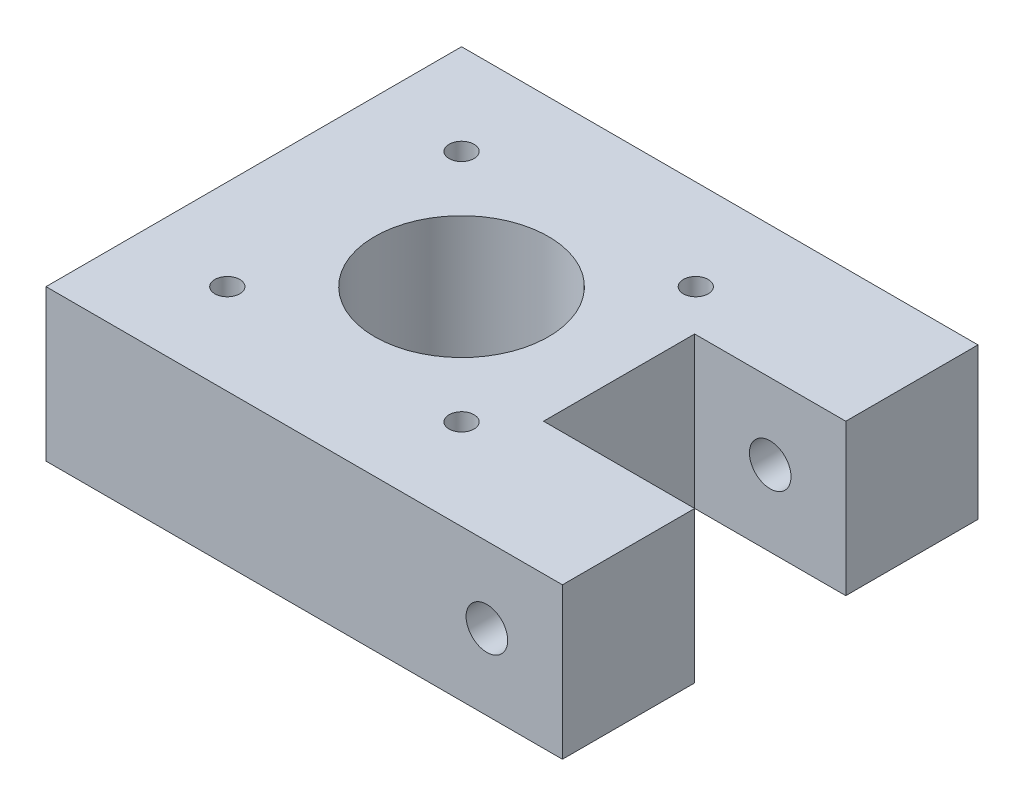
ISO-10303-21;
HEADER;
FILE_DESCRIPTION(('STEP AP214'),'2;1');
FILE_NAME('part.step','',(''),(''),'','','');
FILE_SCHEMA(('AUTOMOTIVE_DESIGN { 1 0 10303 214 1 1 1 1 }'));
ENDSEC;
DATA;
#1=APPLICATION_CONTEXT('core data for automotive mechanical design processes');
#2=APPLICATION_PROTOCOL_DEFINITION('international standard','automotive_design',2000,#1);
#3=PRODUCT_CONTEXT('',#1,'mechanical');
#4=PRODUCT('Part','Part','',(#3));
#5=PRODUCT_RELATED_PRODUCT_CATEGORY('part','',(#4));
#6=PRODUCT_DEFINITION_FORMATION('','',#4);
#7=PRODUCT_DEFINITION_CONTEXT('part definition',#1,'design');
#8=PRODUCT_DEFINITION('design','',#6,#7);
#9=PRODUCT_DEFINITION_SHAPE('','',#8);
#10=(LENGTH_UNIT() NAMED_UNIT(*) SI_UNIT(.MILLI.,.METRE.));
#11=(NAMED_UNIT(*) PLANE_ANGLE_UNIT() SI_UNIT($,.RADIAN.));
#12=(NAMED_UNIT(*) SI_UNIT($,.STERADIAN.) SOLID_ANGLE_UNIT());
#13=UNCERTAINTY_MEASURE_WITH_UNIT(LENGTH_MEASURE(1.E-05),#10,'distance_accuracy_value','');
#14=(GEOMETRIC_REPRESENTATION_CONTEXT(3) GLOBAL_UNCERTAINTY_ASSIGNED_CONTEXT((#13)) GLOBAL_UNIT_ASSIGNED_CONTEXT((#10,
#11,#12)) REPRESENTATION_CONTEXT('',''));
#15=CARTESIAN_POINT('',(0.,0.,0.));
#16=DIRECTION('',(0.,0.,1.));
#17=DIRECTION('',(1.,0.,0.));
#18=AXIS2_PLACEMENT_3D('',#15,#16,#17);
#19=CARTESIAN_POINT('',(-15.5,20.,-15.5));
#20=DIRECTION('',(0.,-1.,0.));
#21=DIRECTION('',(0.,0.,-1.));
#22=AXIS2_PLACEMENT_3D('',#19,#20,#21);
#23=CYLINDRICAL_SURFACE('',#22,1.65);
#24=CARTESIAN_POINT('',(-15.5,20.,-15.5));
#25=DIRECTION('',(0.,1.,0.));
#26=DIRECTION('',(0.,0.,1.));
#27=AXIS2_PLACEMENT_3D('',#24,#25,#26);
#28=CIRCLE('',#27,1.65);
#29=CARTESIAN_POINT('',(-15.5,20.,-13.85));
#30=VERTEX_POINT('',#29);
#31=EDGE_CURVE('E193',#30,#30,#28,.T.);
#32=ORIENTED_EDGE('',*,*,#31,.T.);
#33=EDGE_LOOP('',(#32));
#34=FACE_BOUND('',#33,.T.);
#35=CARTESIAN_POINT('',(-15.5,16.,-15.5));
#36=DIRECTION('',(0.,-1.,0.));
#37=DIRECTION('',(0.,0.,-1.));
#38=AXIS2_PLACEMENT_3D('',#35,#36,#37);
#39=CIRCLE('',#38,1.65);
#40=CARTESIAN_POINT('',(-15.5,16.,-17.15));
#41=VERTEX_POINT('',#40);
#42=EDGE_CURVE('E237',#41,#41,#39,.T.);
#43=ORIENTED_EDGE('',*,*,#42,.T.);
#44=EDGE_LOOP('',(#43));
#45=FACE_BOUND('',#44,.T.);
#46=ADVANCED_FACE('F51',(#34,#45),#23,.F.);
#47=CARTESIAN_POINT('',(15.5,20.,-15.5));
#48=DIRECTION('',(0.,-1.,0.));
#49=DIRECTION('',(0.,0.,-1.));
#50=AXIS2_PLACEMENT_3D('',#47,#48,#49);
#51=CYLINDRICAL_SURFACE('',#50,1.65);
#52=CARTESIAN_POINT('',(15.5,20.,-15.5));
#53=DIRECTION('',(0.,1.,0.));
#54=DIRECTION('',(0.,0.,1.));
#55=AXIS2_PLACEMENT_3D('',#52,#53,#54);
#56=CIRCLE('',#55,1.65);
#57=CARTESIAN_POINT('',(15.5,20.,-13.85));
#58=VERTEX_POINT('',#57);
#59=EDGE_CURVE('E184',#58,#58,#56,.T.);
#60=ORIENTED_EDGE('',*,*,#59,.T.);
#61=EDGE_LOOP('',(#60));
#62=FACE_BOUND('',#61,.T.);
#63=CARTESIAN_POINT('',(15.5,16.,-15.5));
#64=DIRECTION('',(0.,-1.,0.));
#65=DIRECTION('',(0.,0.,-1.));
#66=AXIS2_PLACEMENT_3D('',#63,#64,#65);
#67=CIRCLE('',#66,1.65);
#68=CARTESIAN_POINT('',(15.5,16.,-17.15));
#69=VERTEX_POINT('',#68);
#70=EDGE_CURVE('E234',#69,#69,#67,.T.);
#71=ORIENTED_EDGE('',*,*,#70,.T.);
#72=EDGE_LOOP('',(#71));
#73=FACE_BOUND('',#72,.T.);
#74=ADVANCED_FACE('F312',(#62,#73),#51,.F.);
#75=CARTESIAN_POINT('',(15.5000000000003,20.,15.5));
#76=DIRECTION('',(0.,-1.,0.));
#77=DIRECTION('',(0.,0.,-1.));
#78=AXIS2_PLACEMENT_3D('',#75,#76,#77);
#79=CYLINDRICAL_SURFACE('',#78,1.65);
#80=CARTESIAN_POINT('',(15.5000000000003,20.,15.5));
#81=DIRECTION('',(0.,1.,0.));
#82=DIRECTION('',(0.,0.,1.));
#83=AXIS2_PLACEMENT_3D('',#80,#81,#82);
#84=CIRCLE('',#83,1.65);
#85=CARTESIAN_POINT('',(15.5000000000003,20.,17.15));
#86=VERTEX_POINT('',#85);
#87=EDGE_CURVE('E180',#86,#86,#84,.T.);
#88=ORIENTED_EDGE('',*,*,#87,.T.);
#89=EDGE_LOOP('',(#88));
#90=FACE_BOUND('',#89,.T.);
#91=CARTESIAN_POINT('',(15.5000000000003,16.,15.5));
#92=DIRECTION('',(0.,-1.,0.));
#93=DIRECTION('',(0.,0.,-1.));
#94=AXIS2_PLACEMENT_3D('',#91,#92,#93);
#95=CIRCLE('',#94,1.65);
#96=CARTESIAN_POINT('',(15.5000000000003,16.,13.85));
#97=VERTEX_POINT('',#96);
#98=EDGE_CURVE('E229',#97,#97,#95,.T.);
#99=ORIENTED_EDGE('',*,*,#98,.T.);
#100=EDGE_LOOP('',(#99));
#101=FACE_BOUND('',#100,.T.);
#102=ADVANCED_FACE('F318',(#90,#101),#79,.F.);
#103=CARTESIAN_POINT('',(-15.4999999999997,20.,15.5));
#104=DIRECTION('',(0.,-1.,0.));
#105=DIRECTION('',(0.,0.,-1.));
#106=AXIS2_PLACEMENT_3D('',#103,#104,#105);
#107=CYLINDRICAL_SURFACE('',#106,1.65);
#108=CARTESIAN_POINT('',(-15.4999999999997,20.,15.5));
#109=DIRECTION('',(0.,1.,0.));
#110=DIRECTION('',(0.,0.,1.));
#111=AXIS2_PLACEMENT_3D('',#108,#109,#110);
#112=CIRCLE('',#111,1.65);
#113=CARTESIAN_POINT('',(-15.4999999999997,20.,17.15));
#114=VERTEX_POINT('',#113);
#115=EDGE_CURVE('E177',#114,#114,#112,.T.);
#116=ORIENTED_EDGE('',*,*,#115,.T.);
#117=EDGE_LOOP('',(#116));
#118=FACE_BOUND('',#117,.T.);
#119=CARTESIAN_POINT('',(-15.4999999999997,16.,15.5));
#120=DIRECTION('',(0.,-1.,0.));
#121=DIRECTION('',(0.,0.,-1.));
#122=AXIS2_PLACEMENT_3D('',#119,#120,#121);
#123=CIRCLE('',#122,1.65);
#124=CARTESIAN_POINT('',(-15.4999999999997,16.,13.85));
#125=VERTEX_POINT('',#124);
#126=EDGE_CURVE('E225',#125,#125,#123,.T.);
#127=ORIENTED_EDGE('',*,*,#126,.T.);
#128=EDGE_LOOP('',(#127));
#129=FACE_BOUND('',#128,.T.);
#130=ADVANCED_FACE('F363',(#118,#129),#107,.F.);
#131=CARTESIAN_POINT('',(20.85,20.,-20.85));
#132=DIRECTION('',(-1.,0.,0.));
#133=DIRECTION('',(0.,0.,1.));
#134=AXIS2_PLACEMENT_3D('',#131,#132,#133);
#135=PLANE('',#134);
#136=DIRECTION('',(0.,1.,0.));
#137=VECTOR('',#136,1.);
#138=CARTESIAN_POINT('',(20.85,0.,10.));
#139=LINE('',#138,#137);
#140=CARTESIAN_POINT('',(20.85,0.,10.));
#141=VERTEX_POINT('',#140);
#142=CARTESIAN_POINT('',(20.85,20.,10.));
#143=VERTEX_POINT('',#142);
#144=EDGE_CURVE('E73',#141,#143,#139,.T.);
#145=ORIENTED_EDGE('',*,*,#144,.F.);
#146=DIRECTION('',(0.,0.,-1.));
#147=VECTOR('',#146,1.);
#148=CARTESIAN_POINT('',(20.85,0.,-20.85));
#149=LINE('',#148,#147);
#150=CARTESIAN_POINT('',(20.85,0.,-9.99999999999999));
#151=VERTEX_POINT('',#150);
#152=EDGE_CURVE('E143',#141,#151,#149,.T.);
#153=ORIENTED_EDGE('',*,*,#152,.T.);
#154=DIRECTION('',(0.,1.,0.));
#155=VECTOR('',#154,1.);
#156=CARTESIAN_POINT('',(20.85,0.,-9.99999999999999));
#157=LINE('',#156,#155);
#158=CARTESIAN_POINT('',(20.85,20.,-9.99999999999999));
#159=VERTEX_POINT('',#158);
#160=EDGE_CURVE('E145',#151,#159,#157,.T.);
#161=ORIENTED_EDGE('',*,*,#160,.T.);
#162=DIRECTION('',(0.,0.,-1.));
#163=VECTOR('',#162,1.);
#164=CARTESIAN_POINT('',(20.85,20.,-20.85));
#165=LINE('',#164,#163);
#166=EDGE_CURVE('E69',#143,#159,#165,.T.);
#167=ORIENTED_EDGE('',*,*,#166,.F.);
#168=EDGE_LOOP('',(#145,#153,#161,#167));
#169=FACE_BOUND('',#168,.T.);
#170=ADVANCED_FACE('F53',(#169),#135,.F.);
#171=CARTESIAN_POINT('',(0.,20.,0.));
#172=DIRECTION('',(0.,1.,0.));
#173=DIRECTION('',(0.,0.,1.));
#174=AXIS2_PLACEMENT_3D('',#171,#172,#173);
#175=PLANE('',#174);
#176=ORIENTED_EDGE('',*,*,#87,.F.);
#177=EDGE_LOOP('',(#176));
#178=FACE_BOUND('',#177,.T.);
#179=CARTESIAN_POINT('',(0.,20.,0.));
#180=DIRECTION('',(0.,1.,0.));
#181=DIRECTION('',(0.,0.,1.));
#182=AXIS2_PLACEMENT_3D('',#179,#180,#181);
#183=CIRCLE('',#182,11.5);
#184=CARTESIAN_POINT('',(0.,20.,11.5));
#185=VERTEX_POINT('',#184);
#186=EDGE_CURVE('E189',#185,#185,#183,.T.);
#187=ORIENTED_EDGE('',*,*,#186,.F.);
#188=EDGE_LOOP('',(#187));
#189=FACE_BOUND('',#188,.T.);
#190=DIRECTION('',(1.,0.,0.));
#191=VECTOR('',#190,1.);
#192=CARTESIAN_POINT('',(-27.5,20.,27.5));
#193=LINE('',#192,#191);
#194=CARTESIAN_POINT('',(-27.5,20.,27.5));
#195=VERTEX_POINT('',#194);
#196=CARTESIAN_POINT('',(40.85,20.,27.5));
#197=VERTEX_POINT('',#196);
#198=EDGE_CURVE('E209',#195,#197,#193,.T.);
#199=ORIENTED_EDGE('',*,*,#198,.T.);
#200=DIRECTION('',(0.,0.,1.));
#201=VECTOR('',#200,1.);
#202=CARTESIAN_POINT('',(40.85,20.,0.));
#203=LINE('',#202,#201);
#204=CARTESIAN_POINT('',(40.85,20.,10.));
#205=VERTEX_POINT('',#204);
#206=EDGE_CURVE('E128',#205,#197,#203,.T.);
#207=ORIENTED_EDGE('',*,*,#206,.F.);
#208=DIRECTION('',(-1.,0.,0.));
#209=VECTOR('',#208,1.);
#210=CARTESIAN_POINT('',(40.85,20.,10.));
#211=LINE('',#210,#209);
#212=EDGE_CURVE('E123',#205,#143,#211,.T.);
#213=ORIENTED_EDGE('',*,*,#212,.T.);
#214=ORIENTED_EDGE('',*,*,#166,.T.);
#215=DIRECTION('',(-1.,0.,0.));
#216=VECTOR('',#215,1.);
#217=CARTESIAN_POINT('',(40.85,20.,-9.99999999999998));
#218=LINE('',#217,#216);
#219=CARTESIAN_POINT('',(40.85,20.,-9.99999999999998));
#220=VERTEX_POINT('',#219);
#221=EDGE_CURVE('E169',#220,#159,#218,.T.);
#222=ORIENTED_EDGE('',*,*,#221,.F.);
#223=DIRECTION('',(0.,0.,1.));
#224=VECTOR('',#223,1.);
#225=CARTESIAN_POINT('',(40.85,20.,0.));
#226=LINE('',#225,#224);
#227=CARTESIAN_POINT('',(40.85,20.,-27.5));
#228=VERTEX_POINT('',#227);
#229=EDGE_CURVE('E167',#228,#220,#226,.T.);
#230=ORIENTED_EDGE('',*,*,#229,.F.);
#231=DIRECTION('',(-1.,0.,0.));
#232=VECTOR('',#231,1.);
#233=CARTESIAN_POINT('',(-27.5,20.,-27.5));
#234=LINE('',#233,#232);
#235=CARTESIAN_POINT('',(-27.5,20.,-27.5));
#236=VERTEX_POINT('',#235);
#237=EDGE_CURVE('E202',#228,#236,#234,.T.);
#238=ORIENTED_EDGE('',*,*,#237,.T.);
#239=DIRECTION('',(0.,0.,1.));
#240=VECTOR('',#239,1.);
#241=CARTESIAN_POINT('',(-27.5,20.,-27.5));
#242=LINE('',#241,#240);
#243=EDGE_CURVE('E206',#236,#195,#242,.T.);
#244=ORIENTED_EDGE('',*,*,#243,.T.);
#245=EDGE_LOOP('',(#199,#207,#213,#214,#222,#230,#238,#244));
#246=FACE_BOUND('',#245,.T.);
#247=ORIENTED_EDGE('',*,*,#31,.F.);
#248=EDGE_LOOP('',(#247));
#249=FACE_BOUND('',#248,.T.);
#250=ORIENTED_EDGE('',*,*,#59,.F.);
#251=EDGE_LOOP('',(#250));
#252=FACE_BOUND('',#251,.T.);
#253=ORIENTED_EDGE('',*,*,#115,.F.);
#254=EDGE_LOOP('',(#253));
#255=FACE_BOUND('',#254,.T.);
#256=ADVANCED_FACE('F324',(#178,#189,#246,#249,#252,#255),#175,.T.);
#257=CARTESIAN_POINT('',(0.,0.,0.));
#258=DIRECTION('',(0.,1.,0.));
#259=DIRECTION('',(0.,0.,1.));
#260=AXIS2_PLACEMENT_3D('',#257,#258,#259);
#261=PLANE('',#260);
#262=CARTESIAN_POINT('',(-15.4999999999994,0.,-15.5));
#263=DIRECTION('',(0.,-1.,0.));
#264=DIRECTION('',(0.,0.,-1.));
#265=AXIS2_PLACEMENT_3D('',#262,#263,#264);
#266=CIRCLE('',#265,3.);
#267=CARTESIAN_POINT('',(-15.4999999999994,0.,-18.5));
#268=VERTEX_POINT('',#267);
#269=EDGE_CURVE('E260',#268,#268,#266,.T.);
#270=ORIENTED_EDGE('',*,*,#269,.F.);
#271=EDGE_LOOP('',(#270));
#272=FACE_BOUND('',#271,.T.);
#273=CARTESIAN_POINT('',(15.5000000000006,0.,-15.5));
#274=DIRECTION('',(0.,-1.,0.));
#275=DIRECTION('',(0.,0.,-1.));
#276=AXIS2_PLACEMENT_3D('',#273,#274,#275);
#277=CIRCLE('',#276,3.);
#278=CARTESIAN_POINT('',(15.5000000000006,0.,-18.5));
#279=VERTEX_POINT('',#278);
#280=EDGE_CURVE('E269',#279,#279,#277,.T.);
#281=ORIENTED_EDGE('',*,*,#280,.F.);
#282=EDGE_LOOP('',(#281));
#283=FACE_BOUND('',#282,.T.);
#284=CARTESIAN_POINT('',(15.5000000000003,0.,15.5));
#285=DIRECTION('',(0.,-1.,0.));
#286=DIRECTION('',(0.,0.,-1.));
#287=AXIS2_PLACEMENT_3D('',#284,#285,#286);
#288=CIRCLE('',#287,3.);
#289=CARTESIAN_POINT('',(15.5000000000003,0.,12.5));
#290=VERTEX_POINT('',#289);
#291=EDGE_CURVE('E252',#290,#290,#288,.T.);
#292=ORIENTED_EDGE('',*,*,#291,.F.);
#293=EDGE_LOOP('',(#292));
#294=FACE_BOUND('',#293,.T.);
#295=CARTESIAN_POINT('',(-15.4999999999997,0.,15.5));
#296=DIRECTION('',(0.,-1.,0.));
#297=DIRECTION('',(0.,0.,-1.));
#298=AXIS2_PLACEMENT_3D('',#295,#296,#297);
#299=CIRCLE('',#298,3.);
#300=CARTESIAN_POINT('',(-15.4999999999997,0.,12.5));
#301=VERTEX_POINT('',#300);
#302=EDGE_CURVE('E249',#301,#301,#299,.T.);
#303=ORIENTED_EDGE('',*,*,#302,.F.);
#304=EDGE_LOOP('',(#303));
#305=FACE_BOUND('',#304,.T.);
#306=ORIENTED_EDGE('',*,*,#152,.F.);
#307=DIRECTION('',(-1.,0.,0.));
#308=VECTOR('',#307,1.);
#309=CARTESIAN_POINT('',(40.85,0.,10.));
#310=LINE('',#309,#308);
#311=CARTESIAN_POINT('',(40.85,0.,10.));
#312=VERTEX_POINT('',#311);
#313=EDGE_CURVE('E121',#312,#141,#310,.T.);
#314=ORIENTED_EDGE('',*,*,#313,.F.);
#315=DIRECTION('',(0.,0.,-1.));
#316=VECTOR('',#315,1.);
#317=CARTESIAN_POINT('',(40.85,0.,0.));
#318=LINE('',#317,#316);
#319=CARTESIAN_POINT('',(40.85,0.,27.5));
#320=VERTEX_POINT('',#319);
#321=EDGE_CURVE('E129',#320,#312,#318,.T.);
#322=ORIENTED_EDGE('',*,*,#321,.F.);
#323=DIRECTION('',(1.,0.,0.));
#324=VECTOR('',#323,1.);
#325=CARTESIAN_POINT('',(-27.5,0.,27.5));
#326=LINE('',#325,#324);
#327=CARTESIAN_POINT('',(-27.5,0.,27.5));
#328=VERTEX_POINT('',#327);
#329=EDGE_CURVE('E203',#328,#320,#326,.T.);
#330=ORIENTED_EDGE('',*,*,#329,.F.);
#331=DIRECTION('',(0.,0.,1.));
#332=VECTOR('',#331,1.);
#333=CARTESIAN_POINT('',(-27.5,0.,-27.5));
#334=LINE('',#333,#332);
#335=CARTESIAN_POINT('',(-27.5,0.,-27.5));
#336=VERTEX_POINT('',#335);
#337=EDGE_CURVE('E217',#336,#328,#334,.T.);
#338=ORIENTED_EDGE('',*,*,#337,.F.);
#339=DIRECTION('',(-1.,0.,0.));
#340=VECTOR('',#339,1.);
#341=CARTESIAN_POINT('',(-27.5,0.,-27.5));
#342=LINE('',#341,#340);
#343=CARTESIAN_POINT('',(40.85,0.,-27.5));
#344=VERTEX_POINT('',#343);
#345=EDGE_CURVE('E214',#344,#336,#342,.T.);
#346=ORIENTED_EDGE('',*,*,#345,.F.);
#347=DIRECTION('',(0.,0.,-1.));
#348=VECTOR('',#347,1.);
#349=CARTESIAN_POINT('',(40.85,0.,0.));
#350=LINE('',#349,#348);
#351=CARTESIAN_POINT('',(40.85,0.,-9.99999999999998));
#352=VERTEX_POINT('',#351);
#353=EDGE_CURVE('E159',#352,#344,#350,.T.);
#354=ORIENTED_EDGE('',*,*,#353,.F.);
#355=DIRECTION('',(-1.,0.,0.));
#356=VECTOR('',#355,1.);
#357=CARTESIAN_POINT('',(40.85,0.,-9.99999999999998));
#358=LINE('',#357,#356);
#359=EDGE_CURVE('E174',#352,#151,#358,.T.);
#360=ORIENTED_EDGE('',*,*,#359,.T.);
#361=EDGE_LOOP('',(#306,#314,#322,#330,#338,#346,#354,#360));
#362=FACE_BOUND('',#361,.T.);
#363=CARTESIAN_POINT('',(0.,0.,0.));
#364=DIRECTION('',(0.,1.,0.));
#365=DIRECTION('',(0.,0.,1.));
#366=AXIS2_PLACEMENT_3D('',#363,#364,#365);
#367=CIRCLE('',#366,11.5);
#368=CARTESIAN_POINT('',(0.,0.,11.5));
#369=VERTEX_POINT('',#368);
#370=EDGE_CURVE('E188',#369,#369,#367,.T.);
#371=ORIENTED_EDGE('',*,*,#370,.T.);
#372=EDGE_LOOP('',(#371));
#373=FACE_BOUND('',#372,.T.);
#374=ADVANCED_FACE('F140',(#272,#283,#294,#305,#362,#373),#261,.F.);
#375=CARTESIAN_POINT('',(-27.5,20.,-27.5));
#376=DIRECTION('',(0.,0.,1.));
#377=DIRECTION('',(1.,0.,0.));
#378=AXIS2_PLACEMENT_3D('',#375,#376,#377);
#379=PLANE('',#378);
#380=CARTESIAN_POINT('',(30.85,10.,-27.5));
#381=DIRECTION('',(0.,0.,-1.));
#382=DIRECTION('',(-1.,0.,0.));
#383=AXIS2_PLACEMENT_3D('',#380,#381,#382);
#384=CIRCLE('',#383,2.75);
#385=CARTESIAN_POINT('',(28.1,10.,-27.5));
#386=VERTEX_POINT('',#385);
#387=EDGE_CURVE('E282',#386,#386,#384,.T.);
#388=ORIENTED_EDGE('',*,*,#387,.F.);
#389=EDGE_LOOP('',(#388));
#390=FACE_BOUND('',#389,.T.);
#391=ORIENTED_EDGE('',*,*,#345,.T.);
#392=DIRECTION('',(0.,-1.,0.));
#393=VECTOR('',#392,1.);
#394=CARTESIAN_POINT('',(-27.5,20.,-27.5));
#395=LINE('',#394,#393);
#396=EDGE_CURVE('E11',#236,#336,#395,.T.);
#397=ORIENTED_EDGE('',*,*,#396,.F.);
#398=ORIENTED_EDGE('',*,*,#237,.F.);
#399=DIRECTION('',(0.,1.,0.));
#400=VECTOR('',#399,1.);
#401=CARTESIAN_POINT('',(40.85,0.,-27.5));
#402=LINE('',#401,#400);
#403=EDGE_CURVE('E163',#344,#228,#402,.T.);
#404=ORIENTED_EDGE('',*,*,#403,.F.);
#405=EDGE_LOOP('',(#391,#397,#398,#404));
#406=FACE_BOUND('',#405,.T.);
#407=ADVANCED_FACE('F330',(#390,#406),#379,.F.);
#408=CARTESIAN_POINT('',(-27.5,20.,-27.5));
#409=DIRECTION('',(1.,0.,0.));
#410=DIRECTION('',(0.,0.,-1.));
#411=AXIS2_PLACEMENT_3D('',#408,#409,#410);
#412=PLANE('',#411);
#413=ORIENTED_EDGE('',*,*,#337,.T.);
#414=DIRECTION('',(0.,-1.,0.));
#415=VECTOR('',#414,1.);
#416=CARTESIAN_POINT('',(-27.5,20.,27.5));
#417=LINE('',#416,#415);
#418=EDGE_CURVE('E61',#195,#328,#417,.T.);
#419=ORIENTED_EDGE('',*,*,#418,.F.);
#420=ORIENTED_EDGE('',*,*,#243,.F.);
#421=ORIENTED_EDGE('',*,*,#396,.T.);
#422=EDGE_LOOP('',(#413,#419,#420,#421));
#423=FACE_BOUND('',#422,.T.);
#424=ADVANCED_FACE('F335',(#423),#412,.F.);
#425=CARTESIAN_POINT('',(-27.5,20.,27.5));
#426=DIRECTION('',(0.,0.,-1.));
#427=DIRECTION('',(-1.,0.,0.));
#428=AXIS2_PLACEMENT_3D('',#425,#426,#427);
#429=PLANE('',#428);
#430=CARTESIAN_POINT('',(30.85,10.,27.5));
#431=DIRECTION('',(0.,0.,-1.));
#432=DIRECTION('',(-1.,0.,0.));
#433=AXIS2_PLACEMENT_3D('',#430,#431,#432);
#434=CIRCLE('',#433,2.75);
#435=CARTESIAN_POINT('',(28.1,10.,27.5));
#436=VERTEX_POINT('',#435);
#437=EDGE_CURVE('E286',#436,#436,#434,.T.);
#438=ORIENTED_EDGE('',*,*,#437,.T.);
#439=EDGE_LOOP('',(#438));
#440=FACE_BOUND('',#439,.T.);
#441=ORIENTED_EDGE('',*,*,#329,.T.);
#442=DIRECTION('',(0.,-1.,0.));
#443=VECTOR('',#442,1.);
#444=CARTESIAN_POINT('',(40.85,0.,27.5));
#445=LINE('',#444,#443);
#446=EDGE_CURVE('E135',#197,#320,#445,.T.);
#447=ORIENTED_EDGE('',*,*,#446,.F.);
#448=ORIENTED_EDGE('',*,*,#198,.F.);
#449=ORIENTED_EDGE('',*,*,#418,.T.);
#450=EDGE_LOOP('',(#441,#447,#448,#449));
#451=FACE_BOUND('',#450,.T.);
#452=ADVANCED_FACE('F332',(#440,#451),#429,.F.);
#453=CARTESIAN_POINT('',(0.,20.,0.));
#454=DIRECTION('',(0.,-1.,0.));
#455=DIRECTION('',(0.,0.,-1.));
#456=AXIS2_PLACEMENT_3D('',#453,#454,#455);
#457=CYLINDRICAL_SURFACE('',#456,11.5);
#458=ORIENTED_EDGE('',*,*,#186,.T.);
#459=EDGE_LOOP('',(#458));
#460=FACE_BOUND('',#459,.T.);
#461=ORIENTED_EDGE('',*,*,#370,.F.);
#462=EDGE_LOOP('',(#461));
#463=FACE_BOUND('',#462,.T.);
#464=ADVANCED_FACE('F323',(#460,#463),#457,.F.);
#465=CARTESIAN_POINT('',(40.85,0.,-9.99999999999998));
#466=DIRECTION('',(0.,0.,1.));
#467=DIRECTION('',(1.,0.,0.));
#468=AXIS2_PLACEMENT_3D('',#465,#466,#467);
#469=PLANE('',#468);
#470=CARTESIAN_POINT('',(30.85,10.,-9.99999999999999));
#471=DIRECTION('',(0.,0.,1.));
#472=DIRECTION('',(1.,0.,0.));
#473=AXIS2_PLACEMENT_3D('',#470,#471,#472);
#474=CIRCLE('',#473,2.75);
#475=CARTESIAN_POINT('',(33.6,10.,-9.99999999999999));
#476=VERTEX_POINT('',#475);
#477=EDGE_CURVE('E261',#476,#476,#474,.T.);
#478=ORIENTED_EDGE('',*,*,#477,.F.);
#479=EDGE_LOOP('',(#478));
#480=FACE_BOUND('',#479,.T.);
#481=ORIENTED_EDGE('',*,*,#160,.F.);
#482=ORIENTED_EDGE('',*,*,#359,.F.);
#483=DIRECTION('',(0.,1.,0.));
#484=VECTOR('',#483,1.);
#485=CARTESIAN_POINT('',(40.85,0.,-9.99999999999998));
#486=LINE('',#485,#484);
#487=EDGE_CURVE('E150',#352,#220,#486,.T.);
#488=ORIENTED_EDGE('',*,*,#487,.T.);
#489=ORIENTED_EDGE('',*,*,#221,.T.);
#490=EDGE_LOOP('',(#481,#482,#488,#489));
#491=FACE_BOUND('',#490,.T.);
#492=ADVANCED_FACE('F361',(#480,#491),#469,.T.);
#493=CARTESIAN_POINT('',(40.85,0.,0.));
#494=DIRECTION('',(1.,0.,0.));
#495=DIRECTION('',(0.,0.,-1.));
#496=AXIS2_PLACEMENT_3D('',#493,#494,#495);
#497=PLANE('',#496);
#498=ORIENTED_EDGE('',*,*,#487,.F.);
#499=ORIENTED_EDGE('',*,*,#353,.T.);
#500=ORIENTED_EDGE('',*,*,#403,.T.);
#501=ORIENTED_EDGE('',*,*,#229,.T.);
#502=EDGE_LOOP('',(#498,#499,#500,#501));
#503=FACE_BOUND('',#502,.T.);
#504=ADVANCED_FACE('F358',(#503),#497,.T.);
#505=CARTESIAN_POINT('',(40.85,0.,10.));
#506=DIRECTION('',(0.,0.,1.));
#507=DIRECTION('',(1.,0.,0.));
#508=AXIS2_PLACEMENT_3D('',#505,#506,#507);
#509=PLANE('',#508);
#510=CARTESIAN_POINT('',(30.85,10.,10.));
#511=DIRECTION('',(0.,0.,1.));
#512=DIRECTION('',(1.,0.,0.));
#513=AXIS2_PLACEMENT_3D('',#510,#511,#512);
#514=CIRCLE('',#513,2.75);
#515=CARTESIAN_POINT('',(33.6,10.,10.));
#516=VERTEX_POINT('',#515);
#517=EDGE_CURVE('E55',#516,#516,#514,.T.);
#518=ORIENTED_EDGE('',*,*,#517,.T.);
#519=EDGE_LOOP('',(#518));
#520=FACE_BOUND('',#519,.T.);
#521=ORIENTED_EDGE('',*,*,#144,.T.);
#522=ORIENTED_EDGE('',*,*,#212,.F.);
#523=DIRECTION('',(0.,1.,0.));
#524=VECTOR('',#523,1.);
#525=CARTESIAN_POINT('',(40.85,0.,10.));
#526=LINE('',#525,#524);
#527=EDGE_CURVE('E117',#312,#205,#526,.T.);
#528=ORIENTED_EDGE('',*,*,#527,.F.);
#529=ORIENTED_EDGE('',*,*,#313,.T.);
#530=EDGE_LOOP('',(#521,#522,#528,#529));
#531=FACE_BOUND('',#530,.T.);
#532=ADVANCED_FACE('F119',(#520,#531),#509,.F.);
#533=CARTESIAN_POINT('',(40.85,0.,0.));
#534=DIRECTION('',(1.,0.,0.));
#535=DIRECTION('',(0.,0.,-1.));
#536=AXIS2_PLACEMENT_3D('',#533,#534,#535);
#537=PLANE('',#536);
#538=ORIENTED_EDGE('',*,*,#321,.T.);
#539=ORIENTED_EDGE('',*,*,#527,.T.);
#540=ORIENTED_EDGE('',*,*,#206,.T.);
#541=ORIENTED_EDGE('',*,*,#446,.T.);
#542=EDGE_LOOP('',(#538,#539,#540,#541));
#543=FACE_BOUND('',#542,.T.);
#544=ADVANCED_FACE('F133',(#543),#537,.T.);
#545=CARTESIAN_POINT('',(-15.4999999999997,16.,15.5));
#546=DIRECTION('',(0.,-1.,0.));
#547=DIRECTION('',(0.,0.,-1.));
#548=AXIS2_PLACEMENT_3D('',#545,#546,#547);
#549=CYLINDRICAL_SURFACE('',#548,3.);
#550=CARTESIAN_POINT('',(-15.4999999999997,16.,15.5));
#551=DIRECTION('',(0.,-1.,0.));
#552=DIRECTION('',(0.,0.,-1.));
#553=AXIS2_PLACEMENT_3D('',#550,#551,#552);
#554=CIRCLE('',#553,3.);
#555=CARTESIAN_POINT('',(-15.4999999999997,16.,12.5));
#556=VERTEX_POINT('',#555);
#557=EDGE_CURVE('E230',#556,#556,#554,.T.);
#558=ORIENTED_EDGE('',*,*,#557,.F.);
#559=EDGE_LOOP('',(#558));
#560=FACE_BOUND('',#559,.T.);
#561=ORIENTED_EDGE('',*,*,#302,.T.);
#562=EDGE_LOOP('',(#561));
#563=FACE_BOUND('',#562,.T.);
#564=ADVANCED_FACE('F385',(#560,#563),#549,.F.);
#565=CARTESIAN_POINT('',(-15.4999999999997,16.,15.5));
#566=DIRECTION('',(0.,-1.,0.));
#567=DIRECTION('',(0.,0.,-1.));
#568=AXIS2_PLACEMENT_3D('',#565,#566,#567);
#569=PLANE('',#568);
#570=ORIENTED_EDGE('',*,*,#126,.F.);
#571=EDGE_LOOP('',(#570));
#572=FACE_BOUND('',#571,.T.);
#573=ORIENTED_EDGE('',*,*,#557,.T.);
#574=EDGE_LOOP('',(#573));
#575=FACE_BOUND('',#574,.T.);
#576=ADVANCED_FACE('F388',(#572,#575),#569,.T.);
#577=CARTESIAN_POINT('',(15.5000000000003,16.,15.5));
#578=DIRECTION('',(0.,-1.,0.));
#579=DIRECTION('',(0.,0.,-1.));
#580=AXIS2_PLACEMENT_3D('',#577,#578,#579);
#581=CYLINDRICAL_SURFACE('',#580,3.);
#582=CARTESIAN_POINT('',(15.5000000000003,16.,15.5));
#583=DIRECTION('',(0.,-1.,0.));
#584=DIRECTION('',(0.,0.,-1.));
#585=AXIS2_PLACEMENT_3D('',#582,#583,#584);
#586=CIRCLE('',#585,3.);
#587=CARTESIAN_POINT('',(15.5000000000003,16.,12.5));
#588=VERTEX_POINT('',#587);
#589=EDGE_CURVE('E273',#588,#588,#586,.T.);
#590=ORIENTED_EDGE('',*,*,#589,.F.);
#591=EDGE_LOOP('',(#590));
#592=FACE_BOUND('',#591,.T.);
#593=ORIENTED_EDGE('',*,*,#291,.T.);
#594=EDGE_LOOP('',(#593));
#595=FACE_BOUND('',#594,.T.);
#596=ADVANCED_FACE('F391',(#592,#595),#581,.F.);
#597=CARTESIAN_POINT('',(15.5000000000003,16.,15.5));
#598=DIRECTION('',(0.,-1.,0.));
#599=DIRECTION('',(0.,0.,-1.));
#600=AXIS2_PLACEMENT_3D('',#597,#598,#599);
#601=PLANE('',#600);
#602=ORIENTED_EDGE('',*,*,#98,.F.);
#603=EDGE_LOOP('',(#602));
#604=FACE_BOUND('',#603,.T.);
#605=ORIENTED_EDGE('',*,*,#589,.T.);
#606=EDGE_LOOP('',(#605));
#607=FACE_BOUND('',#606,.T.);
#608=ADVANCED_FACE('F404',(#604,#607),#601,.T.);
#609=CARTESIAN_POINT('',(15.5000000000006,16.,-15.5));
#610=DIRECTION('',(0.,-1.,0.));
#611=DIRECTION('',(0.,0.,-1.));
#612=AXIS2_PLACEMENT_3D('',#609,#610,#611);
#613=CYLINDRICAL_SURFACE('',#612,3.);
#614=CARTESIAN_POINT('',(15.5000000000006,16.,-15.5));
#615=DIRECTION('',(0.,-1.,0.));
#616=DIRECTION('',(0.,0.,-1.));
#617=AXIS2_PLACEMENT_3D('',#614,#615,#616);
#618=CIRCLE('',#617,3.);
#619=CARTESIAN_POINT('',(15.5000000000006,16.,-18.5));
#620=VERTEX_POINT('',#619);
#621=EDGE_CURVE('E265',#620,#620,#618,.T.);
#622=ORIENTED_EDGE('',*,*,#621,.F.);
#623=EDGE_LOOP('',(#622));
#624=FACE_BOUND('',#623,.T.);
#625=ORIENTED_EDGE('',*,*,#280,.T.);
#626=EDGE_LOOP('',(#625));
#627=FACE_BOUND('',#626,.T.);
#628=ADVANCED_FACE('F400',(#624,#627),#613,.F.);
#629=CARTESIAN_POINT('',(15.5000000000006,16.,-15.5));
#630=DIRECTION('',(0.,-1.,0.));
#631=DIRECTION('',(0.,0.,-1.));
#632=AXIS2_PLACEMENT_3D('',#629,#630,#631);
#633=PLANE('',#632);
#634=ORIENTED_EDGE('',*,*,#70,.F.);
#635=EDGE_LOOP('',(#634));
#636=FACE_BOUND('',#635,.T.);
#637=ORIENTED_EDGE('',*,*,#621,.T.);
#638=EDGE_LOOP('',(#637));
#639=FACE_BOUND('',#638,.T.);
#640=ADVANCED_FACE('F396',(#636,#639),#633,.T.);
#641=CARTESIAN_POINT('',(-15.4999999999994,16.,-15.5));
#642=DIRECTION('',(0.,-1.,0.));
#643=DIRECTION('',(0.,0.,-1.));
#644=AXIS2_PLACEMENT_3D('',#641,#642,#643);
#645=CYLINDRICAL_SURFACE('',#644,3.);
#646=CARTESIAN_POINT('',(-15.4999999999994,16.,-15.5));
#647=DIRECTION('',(0.,-1.,0.));
#648=DIRECTION('',(0.,0.,-1.));
#649=AXIS2_PLACEMENT_3D('',#646,#647,#648);
#650=CIRCLE('',#649,3.);
#651=CARTESIAN_POINT('',(-15.4999999999994,16.,-18.5));
#652=VERTEX_POINT('',#651);
#653=EDGE_CURVE('E256',#652,#652,#650,.T.);
#654=ORIENTED_EDGE('',*,*,#653,.F.);
#655=EDGE_LOOP('',(#654));
#656=FACE_BOUND('',#655,.T.);
#657=ORIENTED_EDGE('',*,*,#269,.T.);
#658=EDGE_LOOP('',(#657));
#659=FACE_BOUND('',#658,.T.);
#660=ADVANCED_FACE('F307',(#656,#659),#645,.F.);
#661=CARTESIAN_POINT('',(-15.4999999999994,16.,-15.5));
#662=DIRECTION('',(0.,-1.,0.));
#663=DIRECTION('',(0.,0.,-1.));
#664=AXIS2_PLACEMENT_3D('',#661,#662,#663);
#665=PLANE('',#664);
#666=ORIENTED_EDGE('',*,*,#42,.F.);
#667=EDGE_LOOP('',(#666));
#668=FACE_BOUND('',#667,.T.);
#669=ORIENTED_EDGE('',*,*,#653,.T.);
#670=EDGE_LOOP('',(#669));
#671=FACE_BOUND('',#670,.T.);
#672=ADVANCED_FACE('F299',(#668,#671),#665,.T.);
#673=CARTESIAN_POINT('',(30.85,10.,27.5));
#674=DIRECTION('',(0.,0.,-1.));
#675=DIRECTION('',(-1.,0.,0.));
#676=AXIS2_PLACEMENT_3D('',#673,#674,#675);
#677=CYLINDRICAL_SURFACE('',#676,2.75);
#678=ORIENTED_EDGE('',*,*,#437,.F.);
#679=EDGE_LOOP('',(#678));
#680=FACE_BOUND('',#679,.T.);
#681=ORIENTED_EDGE('',*,*,#517,.F.);
#682=EDGE_LOOP('',(#681));
#683=FACE_BOUND('',#682,.T.);
#684=ADVANCED_FACE('F296',(#680,#683),#677,.F.);
#685=ORIENTED_EDGE('',*,*,#477,.T.);
#686=EDGE_LOOP('',(#685));
#687=FACE_BOUND('',#686,.T.);
#688=ORIENTED_EDGE('',*,*,#387,.T.);
#689=EDGE_LOOP('',(#688));
#690=FACE_BOUND('',#689,.T.);
#691=ADVANCED_FACE('F298',(#687,#690),#677,.F.);
#692=CLOSED_SHELL('',(#46,#74,#102,#130,#170,#256,#374,#407,#424,#452,#464,#492,#504,#532,#544,
#564,#576,#596,#608,#628,#640,#660,#672,#684,#691));
#693=MANIFOLD_SOLID_BREP('B2',#692);
#694=ADVANCED_BREP_SHAPE_REPRESENTATION('',(#18,#693),#14);
#695=SHAPE_DEFINITION_REPRESENTATION(#9,#694);
ENDSEC;
END-ISO-10303-21;
